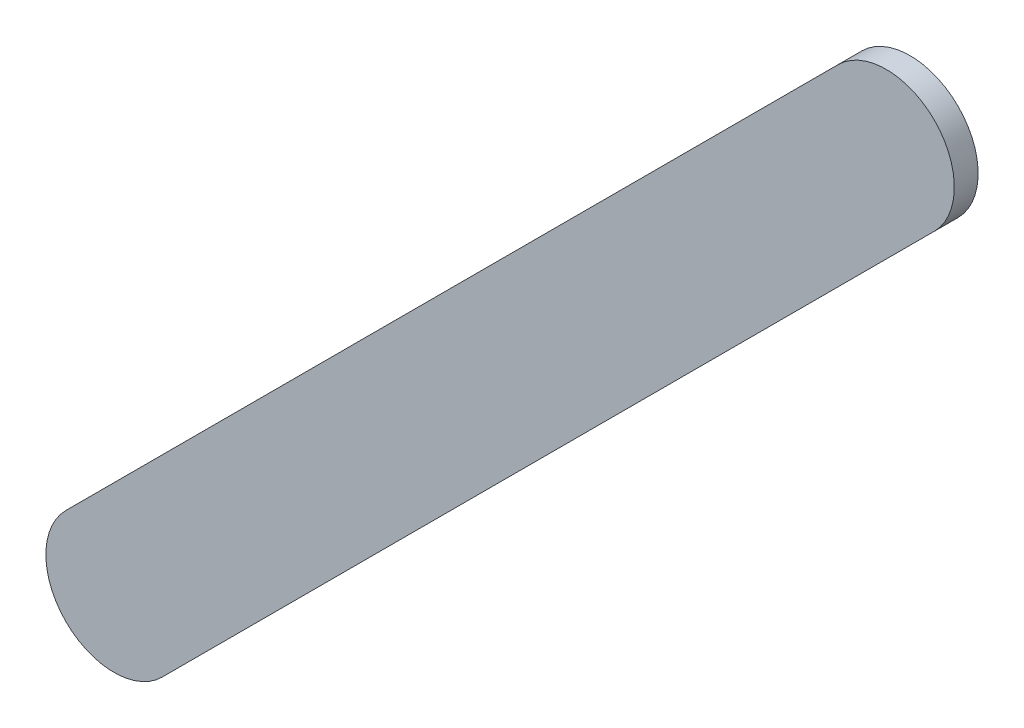
ISO-10303-21;
HEADER;
FILE_DESCRIPTION(('STEP AP214'),'2;1');
FILE_NAME('part.step','',(''),(''),'','','');
FILE_SCHEMA(('AUTOMOTIVE_DESIGN { 1 0 10303 214 1 1 1 1 }'));
ENDSEC;
DATA;
#1=APPLICATION_CONTEXT('core data for automotive mechanical design processes');
#2=APPLICATION_PROTOCOL_DEFINITION('international standard','automotive_design',2000,#1);
#3=PRODUCT_CONTEXT('',#1,'mechanical');
#4=PRODUCT('Part','Part','',(#3));
#5=PRODUCT_RELATED_PRODUCT_CATEGORY('part','',(#4));
#6=PRODUCT_DEFINITION_FORMATION('','',#4);
#7=PRODUCT_DEFINITION_CONTEXT('part definition',#1,'design');
#8=PRODUCT_DEFINITION('design','',#6,#7);
#9=PRODUCT_DEFINITION_SHAPE('','',#8);
#10=(LENGTH_UNIT() NAMED_UNIT(*) SI_UNIT(.MILLI.,.METRE.));
#11=(NAMED_UNIT(*) PLANE_ANGLE_UNIT() SI_UNIT($,.RADIAN.));
#12=(NAMED_UNIT(*) SI_UNIT($,.STERADIAN.) SOLID_ANGLE_UNIT());
#13=UNCERTAINTY_MEASURE_WITH_UNIT(LENGTH_MEASURE(1.E-05),#10,'distance_accuracy_value','');
#14=(GEOMETRIC_REPRESENTATION_CONTEXT(3) GLOBAL_UNCERTAINTY_ASSIGNED_CONTEXT((#13)) GLOBAL_UNIT_ASSIGNED_CONTEXT((#10,
#11,#12)) REPRESENTATION_CONTEXT('',''));
#15=CARTESIAN_POINT('',(0.,0.,0.));
#16=DIRECTION('',(0.,0.,1.));
#17=DIRECTION('',(1.,0.,0.));
#18=AXIS2_PLACEMENT_3D('',#15,#16,#17);
#19=CARTESIAN_POINT('',(93.73571,-117.14571,1.635));
#20=DIRECTION('',(0.,0.,1.));
#21=DIRECTION('',(1.,0.,0.));
#22=AXIS2_PLACEMENT_3D('',#19,#20,#21);
#23=PLANE('',#22);
#24=DIRECTION('',(0.707106781186548,0.707106781186548,0.));
#25=VECTOR('',#24,1.);
#26=CARTESIAN_POINT('',(93.73571,-117.14571,1.635));
#27=LINE('',#26,#25);
#28=CARTESIAN_POINT('',(93.73571,-117.14571,1.635));
#29=VERTEX_POINT('',#28);
#30=CARTESIAN_POINT('',(94.87071,-116.01071,1.635));
#31=VERTEX_POINT('',#30);
#32=EDGE_CURVE('E81',#29,#31,#27,.T.);
#33=ORIENTED_EDGE('',*,*,#32,.T.);
#34=CARTESIAN_POINT('',(94.7999995,-115.9399995,1.635));
#35=DIRECTION('',(0.,0.,1.));
#36=DIRECTION('',(0.707106781186548,-0.707106781186548,0.));
#37=AXIS2_PLACEMENT_3D('',#34,#35,#36);
#38=CIRCLE('',#37,0.09999974810219);
#39=CARTESIAN_POINT('',(94.729289,-115.869289,1.635));
#40=VERTEX_POINT('',#39);
#41=EDGE_CURVE('E104',#31,#40,#38,.T.);
#42=ORIENTED_EDGE('',*,*,#41,.T.);
#43=DIRECTION('',(-0.707106781186548,-0.707106781186548,0.));
#44=VECTOR('',#43,1.);
#45=CARTESIAN_POINT('',(94.729289,-115.869289,1.635));
#46=LINE('',#45,#44);
#47=CARTESIAN_POINT('',(93.594289,-117.004289,1.635));
#48=VERTEX_POINT('',#47);
#49=EDGE_CURVE('E74',#40,#48,#46,.T.);
#50=ORIENTED_EDGE('',*,*,#49,.T.);
#51=CARTESIAN_POINT('',(93.6649995,-117.0749995,1.635));
#52=DIRECTION('',(0.,0.,1.));
#53=DIRECTION('',(-0.707106781186548,0.707106781186548,0.));
#54=AXIS2_PLACEMENT_3D('',#51,#52,#53);
#55=CIRCLE('',#54,0.09999974810218);
#56=EDGE_CURVE('E11',#48,#29,#55,.T.);
#57=ORIENTED_EDGE('',*,*,#56,.T.);
#58=EDGE_LOOP('',(#33,#42,#50,#57));
#59=FACE_BOUND('',#58,.T.);
#60=ADVANCED_FACE('F17',(#59),#23,.T.);
#61=CARTESIAN_POINT('',(93.73571,-117.14571,1.6));
#62=DIRECTION('',(0.,0.,1.));
#63=DIRECTION('',(1.,0.,0.));
#64=AXIS2_PLACEMENT_3D('',#61,#62,#63);
#65=PLANE('',#64);
#66=CARTESIAN_POINT('',(93.6649995,-117.0749995,1.6));
#67=DIRECTION('',(0.,0.,1.));
#68=DIRECTION('',(-0.707106781186548,0.707106781186548,0.));
#69=AXIS2_PLACEMENT_3D('',#66,#67,#68);
#70=CIRCLE('',#69,0.09999974810218);
#71=CARTESIAN_POINT('',(93.594289,-117.004289,1.6));
#72=VERTEX_POINT('',#71);
#73=CARTESIAN_POINT('',(93.73571,-117.14571,1.6));
#74=VERTEX_POINT('',#73);
#75=EDGE_CURVE('E25',#72,#74,#70,.T.);
#76=ORIENTED_EDGE('',*,*,#75,.F.);
#77=DIRECTION('',(-0.707106781186548,-0.707106781186548,0.));
#78=VECTOR('',#77,1.);
#79=CARTESIAN_POINT('',(94.729289,-115.869289,1.6));
#80=LINE('',#79,#78);
#81=CARTESIAN_POINT('',(94.729289,-115.869289,1.6));
#82=VERTEX_POINT('',#81);
#83=EDGE_CURVE('E108',#82,#72,#80,.T.);
#84=ORIENTED_EDGE('',*,*,#83,.F.);
#85=CARTESIAN_POINT('',(94.7999995,-115.9399995,1.6));
#86=DIRECTION('',(0.,0.,1.));
#87=DIRECTION('',(0.707106781186548,-0.707106781186548,0.));
#88=AXIS2_PLACEMENT_3D('',#85,#86,#87);
#89=CIRCLE('',#88,0.09999974810219);
#90=CARTESIAN_POINT('',(94.87071,-116.01071,1.6));
#91=VERTEX_POINT('',#90);
#92=EDGE_CURVE('E83',#91,#82,#89,.T.);
#93=ORIENTED_EDGE('',*,*,#92,.F.);
#94=DIRECTION('',(0.707106781186548,0.707106781186548,0.));
#95=VECTOR('',#94,1.);
#96=CARTESIAN_POINT('',(93.73571,-117.14571,1.6));
#97=LINE('',#96,#95);
#98=EDGE_CURVE('E79',#74,#91,#97,.T.);
#99=ORIENTED_EDGE('',*,*,#98,.F.);
#100=EDGE_LOOP('',(#76,#84,#93,#99));
#101=FACE_BOUND('',#100,.T.);
#102=ADVANCED_FACE('F85',(#101),#65,.F.);
#103=CARTESIAN_POINT('',(93.6649995,-117.0749995,1.6));
#104=DIRECTION('',(0.,0.,-1.));
#105=DIRECTION('',(-0.707106781186548,0.707106781186548,0.));
#106=AXIS2_PLACEMENT_3D('',#103,#104,#105);
#107=CYLINDRICAL_SURFACE('',#106,0.09999974810218);
#108=ORIENTED_EDGE('',*,*,#75,.T.);
#109=DIRECTION('',(0.,0.,1.));
#110=VECTOR('',#109,1.);
#111=CARTESIAN_POINT('',(93.73571,-117.14571,1.6));
#112=LINE('',#111,#110);
#113=EDGE_CURVE('E68',#74,#29,#112,.T.);
#114=ORIENTED_EDGE('',*,*,#113,.T.);
#115=ORIENTED_EDGE('',*,*,#56,.F.);
#116=DIRECTION('',(0.,0.,1.));
#117=VECTOR('',#116,1.);
#118=CARTESIAN_POINT('',(93.594289,-117.004289,1.6));
#119=LINE('',#118,#117);
#120=EDGE_CURVE('E71',#72,#48,#119,.T.);
#121=ORIENTED_EDGE('',*,*,#120,.F.);
#122=EDGE_LOOP('',(#108,#114,#115,#121));
#123=FACE_BOUND('',#122,.T.);
#124=ADVANCED_FACE('F67',(#123),#107,.T.);
#125=CARTESIAN_POINT('',(94.729289,-115.869289,1.6));
#126=DIRECTION('',(0.707106781186548,-0.707106781186548,0.));
#127=DIRECTION('',(0.,0.,-1.));
#128=AXIS2_PLACEMENT_3D('',#125,#126,#127);
#129=PLANE('',#128);
#130=ORIENTED_EDGE('',*,*,#83,.T.);
#131=ORIENTED_EDGE('',*,*,#120,.T.);
#132=ORIENTED_EDGE('',*,*,#49,.F.);
#133=DIRECTION('',(0.,0.,1.));
#134=VECTOR('',#133,1.);
#135=CARTESIAN_POINT('',(94.729289,-115.869289,1.6));
#136=LINE('',#135,#134);
#137=EDGE_CURVE('E100',#82,#40,#136,.T.);
#138=ORIENTED_EDGE('',*,*,#137,.F.);
#139=EDGE_LOOP('',(#130,#131,#132,#138));
#140=FACE_BOUND('',#139,.T.);
#141=ADVANCED_FACE('F119',(#140),#129,.F.);
#142=CARTESIAN_POINT('',(94.7999995,-115.9399995,1.6));
#143=DIRECTION('',(0.,0.,-1.));
#144=DIRECTION('',(0.707106781186548,-0.707106781186548,0.));
#145=AXIS2_PLACEMENT_3D('',#142,#143,#144);
#146=CYLINDRICAL_SURFACE('',#145,0.09999974810219);
#147=ORIENTED_EDGE('',*,*,#92,.T.);
#148=ORIENTED_EDGE('',*,*,#137,.T.);
#149=ORIENTED_EDGE('',*,*,#41,.F.);
#150=DIRECTION('',(0.,0.,1.));
#151=VECTOR('',#150,1.);
#152=CARTESIAN_POINT('',(94.87071,-116.01071,1.6));
#153=LINE('',#152,#151);
#154=EDGE_CURVE('E89',#91,#31,#153,.T.);
#155=ORIENTED_EDGE('',*,*,#154,.F.);
#156=EDGE_LOOP('',(#147,#148,#149,#155));
#157=FACE_BOUND('',#156,.T.);
#158=ADVANCED_FACE('F121',(#157),#146,.T.);
#159=CARTESIAN_POINT('',(93.73571,-117.14571,1.6));
#160=DIRECTION('',(-0.707106781186548,0.707106781186548,0.));
#161=DIRECTION('',(0.,0.,1.));
#162=AXIS2_PLACEMENT_3D('',#159,#160,#161);
#163=PLANE('',#162);
#164=ORIENTED_EDGE('',*,*,#98,.T.);
#165=ORIENTED_EDGE('',*,*,#154,.T.);
#166=ORIENTED_EDGE('',*,*,#32,.F.);
#167=ORIENTED_EDGE('',*,*,#113,.F.);
#168=EDGE_LOOP('',(#164,#165,#166,#167));
#169=FACE_BOUND('',#168,.T.);
#170=ADVANCED_FACE('F77',(#169),#163,.F.);
#171=CLOSED_SHELL('',(#60,#102,#124,#141,#158,#170));
#172=MANIFOLD_SOLID_BREP('B1',#171);
#173=ADVANCED_BREP_SHAPE_REPRESENTATION('',(#18,#172),#14);
#174=SHAPE_DEFINITION_REPRESENTATION(#9,#173);
ENDSEC;
END-ISO-10303-21;
